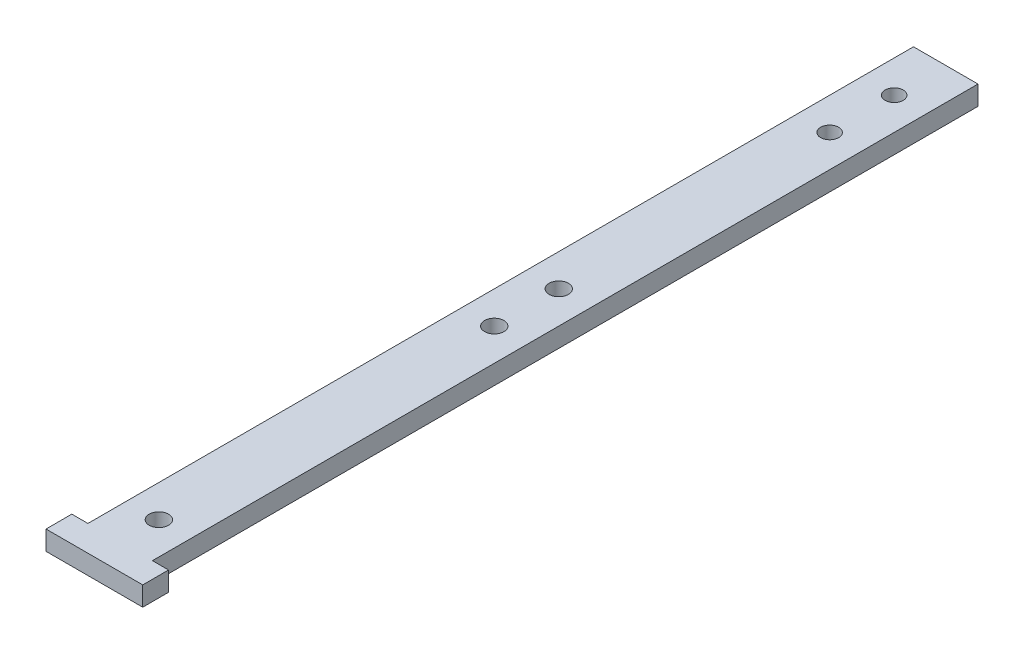
ISO-10303-21;
HEADER;
FILE_DESCRIPTION(('STEP AP214'),'2;1');
FILE_NAME('part.step','',(''),(''),'','','');
FILE_SCHEMA(('AUTOMOTIVE_DESIGN { 1 0 10303 214 1 1 1 1 }'));
ENDSEC;
DATA;
#1=APPLICATION_CONTEXT('core data for automotive mechanical design processes');
#2=APPLICATION_PROTOCOL_DEFINITION('international standard','automotive_design',2000,#1);
#3=PRODUCT_CONTEXT('',#1,'mechanical');
#4=PRODUCT('Part','Part','',(#3));
#5=PRODUCT_RELATED_PRODUCT_CATEGORY('part','',(#4));
#6=PRODUCT_DEFINITION_FORMATION('','',#4);
#7=PRODUCT_DEFINITION_CONTEXT('part definition',#1,'design');
#8=PRODUCT_DEFINITION('design','',#6,#7);
#9=PRODUCT_DEFINITION_SHAPE('','',#8);
#10=(LENGTH_UNIT() NAMED_UNIT(*) SI_UNIT(.MILLI.,.METRE.));
#11=(NAMED_UNIT(*) PLANE_ANGLE_UNIT() SI_UNIT($,.RADIAN.));
#12=(NAMED_UNIT(*) SI_UNIT($,.STERADIAN.) SOLID_ANGLE_UNIT());
#13=UNCERTAINTY_MEASURE_WITH_UNIT(LENGTH_MEASURE(1.E-05),#10,'distance_accuracy_value','');
#14=(GEOMETRIC_REPRESENTATION_CONTEXT(3) GLOBAL_UNCERTAINTY_ASSIGNED_CONTEXT((#13)) GLOBAL_UNIT_ASSIGNED_CONTEXT((#10,
#11,#12)) REPRESENTATION_CONTEXT('',''));
#15=CARTESIAN_POINT('',(0.,0.,0.));
#16=DIRECTION('',(0.,0.,1.));
#17=DIRECTION('',(1.,0.,0.));
#18=AXIS2_PLACEMENT_3D('',#15,#16,#17);
#19=CARTESIAN_POINT('',(47.3767265784286,3.,0.));
#20=DIRECTION('',(1.,0.,0.));
#21=DIRECTION('',(0.,0.,-1.));
#22=AXIS2_PLACEMENT_3D('',#19,#20,#21);
#23=PLANE('',#22);
#24=DIRECTION('',(0.,0.,1.));
#25=VECTOR('',#24,1.);
#26=CARTESIAN_POINT('',(47.3767265784286,0.,0.));
#27=LINE('',#26,#25);
#28=CARTESIAN_POINT('',(47.3767265784286,0.,14.9892846275943));
#29=VERTEX_POINT('',#28);
#30=CARTESIAN_POINT('',(47.3767265784287,0.,142.989284627594));
#31=VERTEX_POINT('',#30);
#32=EDGE_CURVE('E161',#29,#31,#27,.T.);
#33=ORIENTED_EDGE('',*,*,#32,.F.);
#34=DIRECTION('',(0.,-1.,0.));
#35=VECTOR('',#34,1.);
#36=CARTESIAN_POINT('',(47.3767265784286,3.,14.9892846275943));
#37=LINE('',#36,#35);
#38=CARTESIAN_POINT('',(47.3767265784286,3.,14.9892846275943));
#39=VERTEX_POINT('',#38);
#40=EDGE_CURVE('E11',#39,#29,#37,.T.);
#41=ORIENTED_EDGE('',*,*,#40,.F.);
#42=DIRECTION('',(0.,0.,1.));
#43=VECTOR('',#42,1.);
#44=CARTESIAN_POINT('',(47.3767265784286,3.,0.));
#45=LINE('',#44,#43);
#46=CARTESIAN_POINT('',(47.3767265784287,3.,142.989284627594));
#47=VERTEX_POINT('',#46);
#48=EDGE_CURVE('E240',#39,#47,#45,.T.);
#49=ORIENTED_EDGE('',*,*,#48,.T.);
#50=DIRECTION('',(0.,-1.,0.));
#51=VECTOR('',#50,1.);
#52=CARTESIAN_POINT('',(47.3767265784287,3.,142.989284627594));
#53=LINE('',#52,#51);
#54=EDGE_CURVE('E59',#47,#31,#53,.T.);
#55=ORIENTED_EDGE('',*,*,#54,.T.);
#56=EDGE_LOOP('',(#33,#41,#49,#55));
#57=FACE_BOUND('',#56,.T.);
#58=ADVANCED_FACE('F41',(#57),#23,.T.);
#59=CARTESIAN_POINT('',(0.,3.,14.9892846275943));
#60=DIRECTION('',(0.,0.,-1.));
#61=DIRECTION('',(-1.,0.,0.));
#62=AXIS2_PLACEMENT_3D('',#59,#60,#61);
#63=PLANE('',#62);
#64=DIRECTION('',(1.,0.,0.));
#65=VECTOR('',#64,1.);
#66=CARTESIAN_POINT('',(0.,0.,14.9892846275943));
#67=LINE('',#66,#65);
#68=CARTESIAN_POINT('',(37.3767265784286,0.,14.9892846275943));
#69=VERTEX_POINT('',#68);
#70=EDGE_CURVE('E164',#69,#29,#67,.T.);
#71=ORIENTED_EDGE('',*,*,#70,.F.);
#72=DIRECTION('',(0.,-1.,0.));
#73=VECTOR('',#72,1.);
#74=CARTESIAN_POINT('',(37.3767265784286,3.,14.9892846275943));
#75=LINE('',#74,#73);
#76=CARTESIAN_POINT('',(37.3767265784286,3.,14.9892846275943));
#77=VERTEX_POINT('',#76);
#78=EDGE_CURVE('E51',#77,#69,#75,.T.);
#79=ORIENTED_EDGE('',*,*,#78,.F.);
#80=DIRECTION('',(1.,0.,0.));
#81=VECTOR('',#80,1.);
#82=CARTESIAN_POINT('',(0.,3.,14.9892846275943));
#83=LINE('',#82,#81);
#84=EDGE_CURVE('E213',#77,#39,#83,.T.);
#85=ORIENTED_EDGE('',*,*,#84,.T.);
#86=ORIENTED_EDGE('',*,*,#40,.T.);
#87=EDGE_LOOP('',(#71,#79,#85,#86));
#88=FACE_BOUND('',#87,.T.);
#89=ADVANCED_FACE('F212',(#88),#63,.T.);
#90=CARTESIAN_POINT('',(37.3767265784286,3.,0.));
#91=DIRECTION('',(1.,0.,0.));
#92=DIRECTION('',(0.,0.,-1.));
#93=AXIS2_PLACEMENT_3D('',#90,#91,#92);
#94=PLANE('',#93);
#95=DIRECTION('',(0.,0.,1.));
#96=VECTOR('',#95,1.);
#97=CARTESIAN_POINT('',(37.3767265784286,0.,0.));
#98=LINE('',#97,#96);
#99=CARTESIAN_POINT('',(37.3767265784286,0.,142.989284627594));
#100=VERTEX_POINT('',#99);
#101=EDGE_CURVE('E168',#69,#100,#98,.T.);
#102=ORIENTED_EDGE('',*,*,#101,.T.);
#103=DIRECTION('',(0.,-1.,0.));
#104=VECTOR('',#103,1.);
#105=CARTESIAN_POINT('',(37.3767265784286,3.,142.989284627594));
#106=LINE('',#105,#104);
#107=CARTESIAN_POINT('',(37.3767265784286,3.,142.989284627594));
#108=VERTEX_POINT('',#107);
#109=EDGE_CURVE('E195',#108,#100,#106,.T.);
#110=ORIENTED_EDGE('',*,*,#109,.F.);
#111=DIRECTION('',(0.,0.,1.));
#112=VECTOR('',#111,1.);
#113=CARTESIAN_POINT('',(37.3767265784286,3.,0.));
#114=LINE('',#113,#112);
#115=EDGE_CURVE('E203',#77,#108,#114,.T.);
#116=ORIENTED_EDGE('',*,*,#115,.F.);
#117=ORIENTED_EDGE('',*,*,#78,.T.);
#118=EDGE_LOOP('',(#102,#110,#116,#117));
#119=FACE_BOUND('',#118,.T.);
#120=ADVANCED_FACE('F201',(#119),#94,.F.);
#121=CARTESIAN_POINT('',(0.,3.,142.989284627594));
#122=DIRECTION('',(0.,0.,-1.));
#123=DIRECTION('',(-1.,0.,0.));
#124=AXIS2_PLACEMENT_3D('',#121,#122,#123);
#125=PLANE('',#124);
#126=DIRECTION('',(1.,0.,0.));
#127=VECTOR('',#126,1.);
#128=CARTESIAN_POINT('',(0.,0.,142.989284627594));
#129=LINE('',#128,#127);
#130=CARTESIAN_POINT('',(34.8767265784287,0.,142.989284627594));
#131=VERTEX_POINT('',#130);
#132=EDGE_CURVE('E172',#131,#100,#129,.T.);
#133=ORIENTED_EDGE('',*,*,#132,.F.);
#134=DIRECTION('',(0.,-1.,0.));
#135=VECTOR('',#134,1.);
#136=CARTESIAN_POINT('',(34.8767265784287,3.,142.989284627594));
#137=LINE('',#136,#135);
#138=CARTESIAN_POINT('',(34.8767265784287,3.,142.989284627594));
#139=VERTEX_POINT('',#138);
#140=EDGE_CURVE('E192',#139,#131,#137,.T.);
#141=ORIENTED_EDGE('',*,*,#140,.F.);
#142=DIRECTION('',(1.,0.,0.));
#143=VECTOR('',#142,1.);
#144=CARTESIAN_POINT('',(0.,3.,142.989284627594));
#145=LINE('',#144,#143);
#146=EDGE_CURVE('E138',#139,#108,#145,.T.);
#147=ORIENTED_EDGE('',*,*,#146,.T.);
#148=ORIENTED_EDGE('',*,*,#109,.T.);
#149=EDGE_LOOP('',(#133,#141,#147,#148));
#150=FACE_BOUND('',#149,.T.);
#151=ADVANCED_FACE('F250',(#150),#125,.T.);
#152=CARTESIAN_POINT('',(34.8767265784284,3.,0.));
#153=DIRECTION('',(1.,0.,0.));
#154=DIRECTION('',(0.,0.,-1.));
#155=AXIS2_PLACEMENT_3D('',#152,#153,#154);
#156=PLANE('',#155);
#157=DIRECTION('',(0.,0.,1.));
#158=VECTOR('',#157,1.);
#159=CARTESIAN_POINT('',(34.8767265784284,0.,0.));
#160=LINE('',#159,#158);
#161=CARTESIAN_POINT('',(34.8767265784287,0.,146.989284627594));
#162=VERTEX_POINT('',#161);
#163=EDGE_CURVE('E176',#131,#162,#160,.T.);
#164=ORIENTED_EDGE('',*,*,#163,.T.);
#165=DIRECTION('',(0.,-1.,0.));
#166=VECTOR('',#165,1.);
#167=CARTESIAN_POINT('',(34.8767265784287,3.,146.989284627594));
#168=LINE('',#167,#166);
#169=CARTESIAN_POINT('',(34.8767265784287,3.,146.989284627594));
#170=VERTEX_POINT('',#169);
#171=EDGE_CURVE('E130',#170,#162,#168,.T.);
#172=ORIENTED_EDGE('',*,*,#171,.F.);
#173=DIRECTION('',(0.,0.,1.));
#174=VECTOR('',#173,1.);
#175=CARTESIAN_POINT('',(34.8767265784284,3.,0.));
#176=LINE('',#175,#174);
#177=EDGE_CURVE('E117',#139,#170,#176,.T.);
#178=ORIENTED_EDGE('',*,*,#177,.F.);
#179=ORIENTED_EDGE('',*,*,#140,.T.);
#180=EDGE_LOOP('',(#164,#172,#178,#179));
#181=FACE_BOUND('',#180,.T.);
#182=ADVANCED_FACE('F252',(#181),#156,.F.);
#183=CARTESIAN_POINT('',(0.,3.,146.989284627594));
#184=DIRECTION('',(0.,0.,-1.));
#185=DIRECTION('',(-1.,0.,0.));
#186=AXIS2_PLACEMENT_3D('',#183,#184,#185);
#187=PLANE('',#186);
#188=DIRECTION('',(1.,0.,0.));
#189=VECTOR('',#188,1.);
#190=CARTESIAN_POINT('',(0.,0.,146.989284627594));
#191=LINE('',#190,#189);
#192=CARTESIAN_POINT('',(49.8767265784287,0.,146.989284627594));
#193=VERTEX_POINT('',#192);
#194=EDGE_CURVE('E126',#162,#193,#191,.T.);
#195=ORIENTED_EDGE('',*,*,#194,.T.);
#196=DIRECTION('',(0.,-1.,0.));
#197=VECTOR('',#196,1.);
#198=CARTESIAN_POINT('',(49.8767265784287,3.,146.989284627594));
#199=LINE('',#198,#197);
#200=CARTESIAN_POINT('',(49.8767265784287,3.,146.989284627594));
#201=VERTEX_POINT('',#200);
#202=EDGE_CURVE('E124',#201,#193,#199,.T.);
#203=ORIENTED_EDGE('',*,*,#202,.F.);
#204=DIRECTION('',(1.,0.,0.));
#205=VECTOR('',#204,1.);
#206=CARTESIAN_POINT('',(0.,3.,146.989284627594));
#207=LINE('',#206,#205);
#208=EDGE_CURVE('E109',#170,#201,#207,.T.);
#209=ORIENTED_EDGE('',*,*,#208,.F.);
#210=ORIENTED_EDGE('',*,*,#171,.T.);
#211=EDGE_LOOP('',(#195,#203,#209,#210));
#212=FACE_BOUND('',#211,.T.);
#213=ADVANCED_FACE('F125',(#212),#187,.F.);
#214=CARTESIAN_POINT('',(49.8767265784289,3.,0.));
#215=DIRECTION('',(1.,0.,0.));
#216=DIRECTION('',(0.,0.,-1.));
#217=AXIS2_PLACEMENT_3D('',#214,#215,#216);
#218=PLANE('',#217);
#219=DIRECTION('',(0.,0.,1.));
#220=VECTOR('',#219,1.);
#221=CARTESIAN_POINT('',(49.8767265784289,0.,0.));
#222=LINE('',#221,#220);
#223=CARTESIAN_POINT('',(49.8767265784287,0.,142.989284627594));
#224=VERTEX_POINT('',#223);
#225=EDGE_CURVE('E183',#224,#193,#222,.T.);
#226=ORIENTED_EDGE('',*,*,#225,.F.);
#227=DIRECTION('',(0.,-1.,0.));
#228=VECTOR('',#227,1.);
#229=CARTESIAN_POINT('',(49.8767265784287,3.,142.989284627594));
#230=LINE('',#229,#228);
#231=CARTESIAN_POINT('',(49.8767265784287,3.,142.989284627594));
#232=VERTEX_POINT('',#231);
#233=EDGE_CURVE('E84',#232,#224,#230,.T.);
#234=ORIENTED_EDGE('',*,*,#233,.F.);
#235=DIRECTION('',(0.,0.,1.));
#236=VECTOR('',#235,1.);
#237=CARTESIAN_POINT('',(49.8767265784289,3.,0.));
#238=LINE('',#237,#236);
#239=EDGE_CURVE('E114',#232,#201,#238,.T.);
#240=ORIENTED_EDGE('',*,*,#239,.T.);
#241=ORIENTED_EDGE('',*,*,#202,.T.);
#242=EDGE_LOOP('',(#226,#234,#240,#241));
#243=FACE_BOUND('',#242,.T.);
#244=ADVANCED_FACE('F132',(#243),#218,.T.);
#245=CARTESIAN_POINT('',(42.3767265784286,3.,22.9892846275943));
#246=DIRECTION('',(0.,-1.,0.));
#247=DIRECTION('',(0.,0.,-1.));
#248=AXIS2_PLACEMENT_3D('',#245,#246,#247);
#249=CYLINDRICAL_SURFACE('',#248,1.4);
#250=CARTESIAN_POINT('',(42.3767265784286,3.,22.9892846275943));
#251=DIRECTION('',(0.,1.,0.));
#252=DIRECTION('',(0.,0.,1.));
#253=AXIS2_PLACEMENT_3D('',#250,#251,#252);
#254=CIRCLE('',#253,1.4);
#255=CARTESIAN_POINT('',(42.3767265784286,3.,24.3892846275943));
#256=VERTEX_POINT('',#255);
#257=EDGE_CURVE('E236',#256,#256,#254,.T.);
#258=ORIENTED_EDGE('',*,*,#257,.T.);
#259=EDGE_LOOP('',(#258));
#260=FACE_BOUND('',#259,.T.);
#261=CARTESIAN_POINT('',(42.3767265784286,0.,22.9892846275943));
#262=DIRECTION('',(0.,1.,0.));
#263=DIRECTION('',(0.,0.,1.));
#264=AXIS2_PLACEMENT_3D('',#261,#262,#263);
#265=CIRCLE('',#264,1.4);
#266=CARTESIAN_POINT('',(42.3767265784286,0.,24.3892846275943));
#267=VERTEX_POINT('',#266);
#268=EDGE_CURVE('E157',#267,#267,#265,.T.);
#269=ORIENTED_EDGE('',*,*,#268,.F.);
#270=EDGE_LOOP('',(#269));
#271=FACE_BOUND('',#270,.T.);
#272=ADVANCED_FACE('F269',(#260,#271),#249,.F.);
#273=CARTESIAN_POINT('',(42.3767265784286,3.,32.9892846275943));
#274=DIRECTION('',(0.,-1.,0.));
#275=DIRECTION('',(0.,0.,-1.));
#276=AXIS2_PLACEMENT_3D('',#273,#274,#275);
#277=CYLINDRICAL_SURFACE('',#276,1.4);
#278=CARTESIAN_POINT('',(42.3767265784286,3.,32.9892846275943));
#279=DIRECTION('',(0.,1.,0.));
#280=DIRECTION('',(0.,0.,1.));
#281=AXIS2_PLACEMENT_3D('',#278,#279,#280);
#282=CIRCLE('',#281,1.4);
#283=CARTESIAN_POINT('',(42.3767265784286,3.,34.3892846275943));
#284=VERTEX_POINT('',#283);
#285=EDGE_CURVE('E232',#284,#284,#282,.T.);
#286=ORIENTED_EDGE('',*,*,#285,.T.);
#287=EDGE_LOOP('',(#286));
#288=FACE_BOUND('',#287,.T.);
#289=CARTESIAN_POINT('',(42.3767265784286,0.,32.9892846275943));
#290=DIRECTION('',(0.,1.,0.));
#291=DIRECTION('',(0.,0.,1.));
#292=AXIS2_PLACEMENT_3D('',#289,#290,#291);
#293=CIRCLE('',#292,1.4);
#294=CARTESIAN_POINT('',(42.3767265784286,0.,34.3892846275943));
#295=VERTEX_POINT('',#294);
#296=EDGE_CURVE('E153',#295,#295,#293,.T.);
#297=ORIENTED_EDGE('',*,*,#296,.F.);
#298=EDGE_LOOP('',(#297));
#299=FACE_BOUND('',#298,.T.);
#300=ADVANCED_FACE('F272',(#288,#299),#277,.F.);
#301=CARTESIAN_POINT('',(42.3767265784287,3.,136.989284627594));
#302=DIRECTION('',(0.,-1.,0.));
#303=DIRECTION('',(0.,0.,-1.));
#304=AXIS2_PLACEMENT_3D('',#301,#302,#303);
#305=CYLINDRICAL_SURFACE('',#304,1.5);
#306=CARTESIAN_POINT('',(42.3767265784287,3.,136.989284627594));
#307=DIRECTION('',(0.,1.,0.));
#308=DIRECTION('',(0.,0.,1.));
#309=AXIS2_PLACEMENT_3D('',#306,#307,#308);
#310=CIRCLE('',#309,1.5);
#311=CARTESIAN_POINT('',(42.3767265784287,3.,138.489284627594));
#312=VERTEX_POINT('',#311);
#313=EDGE_CURVE('E226',#312,#312,#310,.T.);
#314=ORIENTED_EDGE('',*,*,#313,.T.);
#315=EDGE_LOOP('',(#314));
#316=FACE_BOUND('',#315,.T.);
#317=CARTESIAN_POINT('',(42.3767265784287,0.,136.989284627594));
#318=DIRECTION('',(0.,1.,0.));
#319=DIRECTION('',(0.,0.,1.));
#320=AXIS2_PLACEMENT_3D('',#317,#318,#319);
#321=CIRCLE('',#320,1.5);
#322=CARTESIAN_POINT('',(42.3767265784287,0.,138.489284627594));
#323=VERTEX_POINT('',#322);
#324=EDGE_CURVE('E149',#323,#323,#321,.T.);
#325=ORIENTED_EDGE('',*,*,#324,.F.);
#326=EDGE_LOOP('',(#325));
#327=FACE_BOUND('',#326,.T.);
#328=ADVANCED_FACE('F276',(#316,#327),#305,.F.);
#329=CARTESIAN_POINT('',(42.3767265784286,3.,84.9892846275943));
#330=DIRECTION('',(0.,-1.,0.));
#331=DIRECTION('',(0.,0.,-1.));
#332=AXIS2_PLACEMENT_3D('',#329,#330,#331);
#333=CYLINDRICAL_SURFACE('',#332,1.5);
#334=CARTESIAN_POINT('',(42.3767265784286,3.,84.9892846275943));
#335=DIRECTION('',(0.,1.,0.));
#336=DIRECTION('',(0.,0.,1.));
#337=AXIS2_PLACEMENT_3D('',#334,#335,#336);
#338=CIRCLE('',#337,1.5);
#339=CARTESIAN_POINT('',(42.3767265784286,3.,86.4892846275943));
#340=VERTEX_POINT('',#339);
#341=EDGE_CURVE('E220',#340,#340,#338,.T.);
#342=ORIENTED_EDGE('',*,*,#341,.T.);
#343=EDGE_LOOP('',(#342));
#344=FACE_BOUND('',#343,.T.);
#345=CARTESIAN_POINT('',(42.3767265784286,0.,84.9892846275943));
#346=DIRECTION('',(0.,1.,0.));
#347=DIRECTION('',(0.,0.,1.));
#348=AXIS2_PLACEMENT_3D('',#345,#346,#347);
#349=CIRCLE('',#348,1.5);
#350=CARTESIAN_POINT('',(42.3767265784286,0.,86.4892846275943));
#351=VERTEX_POINT('',#350);
#352=EDGE_CURVE('E145',#351,#351,#349,.T.);
#353=ORIENTED_EDGE('',*,*,#352,.F.);
#354=EDGE_LOOP('',(#353));
#355=FACE_BOUND('',#354,.T.);
#356=ADVANCED_FACE('F279',(#344,#355),#333,.F.);
#357=CARTESIAN_POINT('',(42.3767265784286,3.,74.9892846275943));
#358=DIRECTION('',(0.,-1.,0.));
#359=DIRECTION('',(0.,0.,-1.));
#360=AXIS2_PLACEMENT_3D('',#357,#358,#359);
#361=CYLINDRICAL_SURFACE('',#360,1.5);
#362=CARTESIAN_POINT('',(42.3767265784286,3.,74.9892846275943));
#363=DIRECTION('',(0.,1.,0.));
#364=DIRECTION('',(0.,0.,1.));
#365=AXIS2_PLACEMENT_3D('',#362,#363,#364);
#366=CIRCLE('',#365,1.5);
#367=CARTESIAN_POINT('',(42.3767265784286,3.,76.4892846275943));
#368=VERTEX_POINT('',#367);
#369=EDGE_CURVE('E217',#368,#368,#366,.T.);
#370=ORIENTED_EDGE('',*,*,#369,.T.);
#371=EDGE_LOOP('',(#370));
#372=FACE_BOUND('',#371,.T.);
#373=CARTESIAN_POINT('',(42.3767265784286,0.,74.9892846275943));
#374=DIRECTION('',(0.,1.,0.));
#375=DIRECTION('',(0.,0.,1.));
#376=AXIS2_PLACEMENT_3D('',#373,#374,#375);
#377=CIRCLE('',#376,1.5);
#378=CARTESIAN_POINT('',(42.3767265784286,0.,76.4892846275943));
#379=VERTEX_POINT('',#378);
#380=EDGE_CURVE('E141',#379,#379,#377,.T.);
#381=ORIENTED_EDGE('',*,*,#380,.F.);
#382=EDGE_LOOP('',(#381));
#383=FACE_BOUND('',#382,.T.);
#384=ADVANCED_FACE('F43',(#372,#383),#361,.F.);
#385=EDGE_CURVE('E177',#31,#224,#129,.T.);
#386=ORIENTED_EDGE('',*,*,#385,.F.);
#387=ORIENTED_EDGE('',*,*,#54,.F.);
#388=EDGE_CURVE('E134',#47,#232,#145,.T.);
#389=ORIENTED_EDGE('',*,*,#388,.T.);
#390=ORIENTED_EDGE('',*,*,#233,.T.);
#391=EDGE_LOOP('',(#386,#387,#389,#390));
#392=FACE_BOUND('',#391,.T.);
#393=ADVANCED_FACE('F215',(#392),#125,.T.);
#394=CARTESIAN_POINT('',(0.,3.,0.));
#395=DIRECTION('',(0.,1.,0.));
#396=DIRECTION('',(0.,0.,1.));
#397=AXIS2_PLACEMENT_3D('',#394,#395,#396);
#398=PLANE('',#397);
#399=ORIENTED_EDGE('',*,*,#369,.F.);
#400=EDGE_LOOP('',(#399));
#401=FACE_BOUND('',#400,.T.);
#402=ORIENTED_EDGE('',*,*,#341,.F.);
#403=EDGE_LOOP('',(#402));
#404=FACE_BOUND('',#403,.T.);
#405=ORIENTED_EDGE('',*,*,#313,.F.);
#406=EDGE_LOOP('',(#405));
#407=FACE_BOUND('',#406,.T.);
#408=ORIENTED_EDGE('',*,*,#285,.F.);
#409=EDGE_LOOP('',(#408));
#410=FACE_BOUND('',#409,.T.);
#411=ORIENTED_EDGE('',*,*,#257,.F.);
#412=EDGE_LOOP('',(#411));
#413=FACE_BOUND('',#412,.T.);
#414=ORIENTED_EDGE('',*,*,#48,.F.);
#415=ORIENTED_EDGE('',*,*,#84,.F.);
#416=ORIENTED_EDGE('',*,*,#115,.T.);
#417=ORIENTED_EDGE('',*,*,#146,.F.);
#418=ORIENTED_EDGE('',*,*,#177,.T.);
#419=ORIENTED_EDGE('',*,*,#208,.T.);
#420=ORIENTED_EDGE('',*,*,#239,.F.);
#421=ORIENTED_EDGE('',*,*,#388,.F.);
#422=EDGE_LOOP('',(#414,#415,#416,#417,#418,#419,#420,#421));
#423=FACE_BOUND('',#422,.T.);
#424=ADVANCED_FACE('F111',(#401,#404,#407,#410,#413,#423),#398,.T.);
#425=CARTESIAN_POINT('',(0.,0.,0.));
#426=DIRECTION('',(0.,1.,0.));
#427=DIRECTION('',(0.,0.,1.));
#428=AXIS2_PLACEMENT_3D('',#425,#426,#427);
#429=PLANE('',#428);
#430=ORIENTED_EDGE('',*,*,#380,.T.);
#431=EDGE_LOOP('',(#430));
#432=FACE_BOUND('',#431,.T.);
#433=ORIENTED_EDGE('',*,*,#352,.T.);
#434=EDGE_LOOP('',(#433));
#435=FACE_BOUND('',#434,.T.);
#436=ORIENTED_EDGE('',*,*,#324,.T.);
#437=EDGE_LOOP('',(#436));
#438=FACE_BOUND('',#437,.T.);
#439=ORIENTED_EDGE('',*,*,#296,.T.);
#440=EDGE_LOOP('',(#439));
#441=FACE_BOUND('',#440,.T.);
#442=ORIENTED_EDGE('',*,*,#268,.T.);
#443=EDGE_LOOP('',(#442));
#444=FACE_BOUND('',#443,.T.);
#445=ORIENTED_EDGE('',*,*,#32,.T.);
#446=ORIENTED_EDGE('',*,*,#385,.T.);
#447=ORIENTED_EDGE('',*,*,#225,.T.);
#448=ORIENTED_EDGE('',*,*,#194,.F.);
#449=ORIENTED_EDGE('',*,*,#163,.F.);
#450=ORIENTED_EDGE('',*,*,#132,.T.);
#451=ORIENTED_EDGE('',*,*,#101,.F.);
#452=ORIENTED_EDGE('',*,*,#70,.T.);
#453=EDGE_LOOP('',(#445,#446,#447,#448,#449,#450,#451,#452));
#454=FACE_BOUND('',#453,.T.);
#455=ADVANCED_FACE('F209',(#432,#435,#438,#441,#444,#454),#429,.F.);
#456=CLOSED_SHELL('',(#58,#89,#120,#151,#182,#213,#244,#272,#300,#328,#356,#384,#393,#424,#455));
#457=MANIFOLD_SOLID_BREP('B2',#456);
#458=ADVANCED_BREP_SHAPE_REPRESENTATION('',(#18,#457),#14);
#459=SHAPE_DEFINITION_REPRESENTATION(#9,#458);
ENDSEC;
END-ISO-10303-21;
